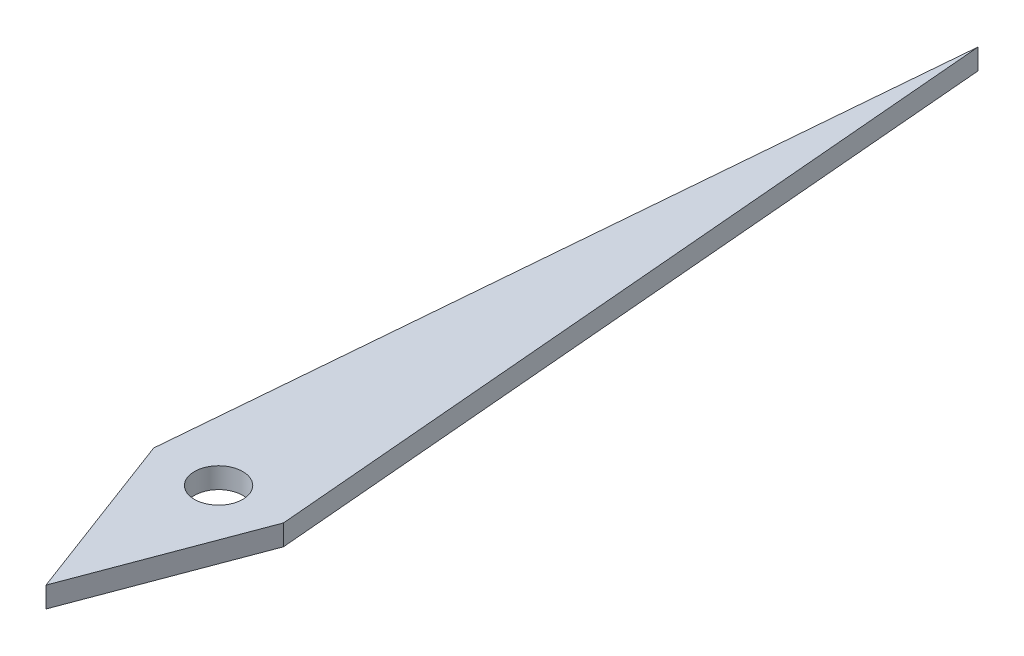
ISO-10303-21;
HEADER;
FILE_DESCRIPTION(('STEP AP214'),'2;1');
FILE_NAME('part.step','',(''),(''),'','','');
FILE_SCHEMA(('AUTOMOTIVE_DESIGN { 1 0 10303 214 1 1 1 1 }'));
ENDSEC;
DATA;
#1=APPLICATION_CONTEXT('core data for automotive mechanical design processes');
#2=APPLICATION_PROTOCOL_DEFINITION('international standard','automotive_design',2000,#1);
#3=PRODUCT_CONTEXT('',#1,'mechanical');
#4=PRODUCT('Part','Part','',(#3));
#5=PRODUCT_RELATED_PRODUCT_CATEGORY('part','',(#4));
#6=PRODUCT_DEFINITION_FORMATION('','',#4);
#7=PRODUCT_DEFINITION_CONTEXT('part definition',#1,'design');
#8=PRODUCT_DEFINITION('design','',#6,#7);
#9=PRODUCT_DEFINITION_SHAPE('','',#8);
#10=(LENGTH_UNIT() NAMED_UNIT(*) SI_UNIT(.MILLI.,.METRE.));
#11=(NAMED_UNIT(*) PLANE_ANGLE_UNIT() SI_UNIT($,.RADIAN.));
#12=(NAMED_UNIT(*) SI_UNIT($,.STERADIAN.) SOLID_ANGLE_UNIT());
#13=UNCERTAINTY_MEASURE_WITH_UNIT(LENGTH_MEASURE(1.E-05),#10,'distance_accuracy_value','');
#14=(GEOMETRIC_REPRESENTATION_CONTEXT(3) GLOBAL_UNCERTAINTY_ASSIGNED_CONTEXT((#13)) GLOBAL_UNIT_ASSIGNED_CONTEXT((#10,
#11,#12)) REPRESENTATION_CONTEXT('',''));
#15=CARTESIAN_POINT('',(0.,0.,0.));
#16=DIRECTION('',(0.,0.,1.));
#17=DIRECTION('',(1.,0.,0.));
#18=AXIS2_PLACEMENT_3D('',#15,#16,#17);
#19=CARTESIAN_POINT('',(0.,0.3,2.5));
#20=DIRECTION('',(0.936021085003514,0.,-0.351943927961321));
#21=DIRECTION('',(-0.351943927961322,0.,-0.936021085003514));
#22=AXIS2_PLACEMENT_3D('',#19,#20,#21);
#23=PLANE('',#22);
#24=DIRECTION('',(0.351943927961321,0.,0.936021085003514));
#25=VECTOR('',#24,1.);
#26=CARTESIAN_POINT('',(0.,0.,2.5));
#27=LINE('',#26,#25);
#28=CARTESIAN_POINT('',(-0.94,0.,0.));
#29=VERTEX_POINT('',#28);
#30=CARTESIAN_POINT('',(0.,0.,2.5));
#31=VERTEX_POINT('',#30);
#32=EDGE_CURVE('E96',#29,#31,#27,.T.);
#33=ORIENTED_EDGE('',*,*,#32,.T.);
#34=DIRECTION('',(0.,-1.,0.));
#35=VECTOR('',#34,1.);
#36=CARTESIAN_POINT('',(0.,0.3,2.5));
#37=LINE('',#36,#35);
#38=CARTESIAN_POINT('',(0.,0.3,2.5));
#39=VERTEX_POINT('',#38);
#40=EDGE_CURVE('E11',#39,#31,#37,.T.);
#41=ORIENTED_EDGE('',*,*,#40,.F.);
#42=DIRECTION('',(0.351943927961321,0.,0.936021085003514));
#43=VECTOR('',#42,1.);
#44=CARTESIAN_POINT('',(0.,0.3,2.5));
#45=LINE('',#44,#43);
#46=CARTESIAN_POINT('',(-0.94,0.3,0.));
#47=VERTEX_POINT('',#46);
#48=EDGE_CURVE('E84',#47,#39,#45,.T.);
#49=ORIENTED_EDGE('',*,*,#48,.F.);
#50=DIRECTION('',(0.,-1.,0.));
#51=VECTOR('',#50,1.);
#52=CARTESIAN_POINT('',(-0.94,0.3,0.));
#53=LINE('',#52,#51);
#54=EDGE_CURVE('E92',#47,#29,#53,.T.);
#55=ORIENTED_EDGE('',*,*,#54,.T.);
#56=EDGE_LOOP('',(#33,#41,#49,#55));
#57=FACE_BOUND('',#56,.T.);
#58=ADVANCED_FACE('F33',(#57),#23,.F.);
#59=CARTESIAN_POINT('',(0.94,0.3,0.));
#60=DIRECTION('',(-0.936021085003514,0.,-0.351943927961321));
#61=DIRECTION('',(-0.351943927961321,0.,0.936021085003514));
#62=AXIS2_PLACEMENT_3D('',#59,#60,#61);
#63=PLANE('',#62);
#64=DIRECTION('',(0.351943927961321,0.,-0.936021085003514));
#65=VECTOR('',#64,1.);
#66=CARTESIAN_POINT('',(0.94,0.,0.));
#67=LINE('',#66,#65);
#68=CARTESIAN_POINT('',(0.94,0.,0.));
#69=VERTEX_POINT('',#68);
#70=EDGE_CURVE('E88',#31,#69,#67,.T.);
#71=ORIENTED_EDGE('',*,*,#70,.T.);
#72=DIRECTION('',(0.,-1.,0.));
#73=VECTOR('',#72,1.);
#74=CARTESIAN_POINT('',(0.94,0.3,0.));
#75=LINE('',#74,#73);
#76=CARTESIAN_POINT('',(0.94,0.3,0.));
#77=VERTEX_POINT('',#76);
#78=EDGE_CURVE('E41',#77,#69,#75,.T.);
#79=ORIENTED_EDGE('',*,*,#78,.F.);
#80=DIRECTION('',(0.351943927961321,0.,-0.936021085003514));
#81=VECTOR('',#80,1.);
#82=CARTESIAN_POINT('',(0.94,0.3,0.));
#83=LINE('',#82,#81);
#84=EDGE_CURVE('E79',#39,#77,#83,.T.);
#85=ORIENTED_EDGE('',*,*,#84,.F.);
#86=ORIENTED_EDGE('',*,*,#40,.T.);
#87=EDGE_LOOP('',(#71,#79,#85,#86));
#88=FACE_BOUND('',#87,.T.);
#89=ADVANCED_FACE('F87',(#88),#63,.F.);
#90=CARTESIAN_POINT('',(0.,0.3,-11.));
#91=DIRECTION('',(-0.996368636738037,0.,0.085144228957614));
#92=DIRECTION('',(0.085144228957614,0.,0.996368636738037));
#93=AXIS2_PLACEMENT_3D('',#90,#91,#92);
#94=PLANE('',#93);
#95=DIRECTION('',(-0.085144228957614,0.,-0.996368636738037));
#96=VECTOR('',#95,1.);
#97=CARTESIAN_POINT('',(0.,0.,-11.));
#98=LINE('',#97,#96);
#99=CARTESIAN_POINT('',(0.,0.,-11.));
#100=VERTEX_POINT('',#99);
#101=EDGE_CURVE('E66',#69,#100,#98,.T.);
#102=ORIENTED_EDGE('',*,*,#101,.T.);
#103=DIRECTION('',(0.,-1.,0.));
#104=VECTOR('',#103,1.);
#105=CARTESIAN_POINT('',(0.,0.3,-11.));
#106=LINE('',#105,#104);
#107=CARTESIAN_POINT('',(0.,0.3,-11.));
#108=VERTEX_POINT('',#107);
#109=EDGE_CURVE('E89',#108,#100,#106,.T.);
#110=ORIENTED_EDGE('',*,*,#109,.F.);
#111=DIRECTION('',(-0.085144228957614,0.,-0.996368636738037));
#112=VECTOR('',#111,1.);
#113=CARTESIAN_POINT('',(0.,0.3,-11.));
#114=LINE('',#113,#112);
#115=EDGE_CURVE('E82',#77,#108,#114,.T.);
#116=ORIENTED_EDGE('',*,*,#115,.F.);
#117=ORIENTED_EDGE('',*,*,#78,.T.);
#118=EDGE_LOOP('',(#102,#110,#116,#117));
#119=FACE_BOUND('',#118,.T.);
#120=ADVANCED_FACE('F90',(#119),#94,.F.);
#121=CARTESIAN_POINT('',(-0.94,0.3,0.));
#122=DIRECTION('',(0.996368636738037,0.,0.085144228957614));
#123=DIRECTION('',(0.085144228957614,0.,-0.996368636738037));
#124=AXIS2_PLACEMENT_3D('',#121,#122,#123);
#125=PLANE('',#124);
#126=DIRECTION('',(-0.085144228957614,0.,0.996368636738037));
#127=VECTOR('',#126,1.);
#128=CARTESIAN_POINT('',(-0.94,0.,0.));
#129=LINE('',#128,#127);
#130=EDGE_CURVE('E72',#100,#29,#129,.T.);
#131=ORIENTED_EDGE('',*,*,#130,.T.);
#132=ORIENTED_EDGE('',*,*,#54,.F.);
#133=DIRECTION('',(-0.085144228957614,0.,0.996368636738037));
#134=VECTOR('',#133,1.);
#135=CARTESIAN_POINT('',(-0.94,0.3,0.));
#136=LINE('',#135,#134);
#137=EDGE_CURVE('E49',#108,#47,#136,.T.);
#138=ORIENTED_EDGE('',*,*,#137,.F.);
#139=ORIENTED_EDGE('',*,*,#109,.T.);
#140=EDGE_LOOP('',(#131,#132,#138,#139));
#141=FACE_BOUND('',#140,.T.);
#142=ADVANCED_FACE('F104',(#141),#125,.F.);
#143=CARTESIAN_POINT('',(0.,0.3,0.));
#144=DIRECTION('',(0.,1.,0.));
#145=DIRECTION('',(0.,0.,1.));
#146=AXIS2_PLACEMENT_3D('',#143,#144,#145);
#147=PLANE('',#146);
#148=CARTESIAN_POINT('',(0.,0.3,0.));
#149=DIRECTION('',(0.,1.,0.));
#150=DIRECTION('',(0.,0.,1.));
#151=AXIS2_PLACEMENT_3D('',#148,#149,#150);
#152=CIRCLE('',#151,0.35);
#153=CARTESIAN_POINT('',(0.,0.3,0.35));
#154=VERTEX_POINT('',#153);
#155=EDGE_CURVE('E110',#154,#154,#152,.T.);
#156=ORIENTED_EDGE('',*,*,#155,.F.);
#157=EDGE_LOOP('',(#156));
#158=FACE_BOUND('',#157,.T.);
#159=ORIENTED_EDGE('',*,*,#48,.T.);
#160=ORIENTED_EDGE('',*,*,#84,.T.);
#161=ORIENTED_EDGE('',*,*,#115,.T.);
#162=ORIENTED_EDGE('',*,*,#137,.T.);
#163=EDGE_LOOP('',(#159,#160,#161,#162));
#164=FACE_BOUND('',#163,.T.);
#165=ADVANCED_FACE('F80',(#158,#164),#147,.T.);
#166=CARTESIAN_POINT('',(0.,0.,0.));
#167=DIRECTION('',(0.,1.,0.));
#168=DIRECTION('',(0.,0.,1.));
#169=AXIS2_PLACEMENT_3D('',#166,#167,#168);
#170=PLANE('',#169);
#171=CARTESIAN_POINT('',(0.,0.,0.));
#172=DIRECTION('',(0.,1.,0.));
#173=DIRECTION('',(0.,0.,1.));
#174=AXIS2_PLACEMENT_3D('',#171,#172,#173);
#175=CIRCLE('',#174,0.35);
#176=CARTESIAN_POINT('',(0.,0.,0.35));
#177=VERTEX_POINT('',#176);
#178=EDGE_CURVE('E99',#177,#177,#175,.T.);
#179=ORIENTED_EDGE('',*,*,#178,.T.);
#180=EDGE_LOOP('',(#179));
#181=FACE_BOUND('',#180,.T.);
#182=ORIENTED_EDGE('',*,*,#32,.F.);
#183=ORIENTED_EDGE('',*,*,#130,.F.);
#184=ORIENTED_EDGE('',*,*,#101,.F.);
#185=ORIENTED_EDGE('',*,*,#70,.F.);
#186=EDGE_LOOP('',(#182,#183,#184,#185));
#187=FACE_BOUND('',#186,.T.);
#188=ADVANCED_FACE('F107',(#181,#187),#170,.F.);
#189=CARTESIAN_POINT('',(0.,0.,0.));
#190=DIRECTION('',(0.,1.,0.));
#191=DIRECTION('',(0.,0.,1.));
#192=AXIS2_PLACEMENT_3D('',#189,#190,#191);
#193=CYLINDRICAL_SURFACE('',#192,0.35);
#194=ORIENTED_EDGE('',*,*,#178,.F.);
#195=EDGE_LOOP('',(#194));
#196=FACE_BOUND('',#195,.T.);
#197=ORIENTED_EDGE('',*,*,#155,.T.);
#198=EDGE_LOOP('',(#197));
#199=FACE_BOUND('',#198,.T.);
#200=ADVANCED_FACE('F117',(#196,#199),#193,.F.);
#201=CLOSED_SHELL('',(#58,#89,#120,#142,#165,#188,#200));
#202=MANIFOLD_SOLID_BREP('B2',#201);
#203=ADVANCED_BREP_SHAPE_REPRESENTATION('',(#18,#202),#14);
#204=SHAPE_DEFINITION_REPRESENTATION(#9,#203);
ENDSEC;
END-ISO-10303-21;
